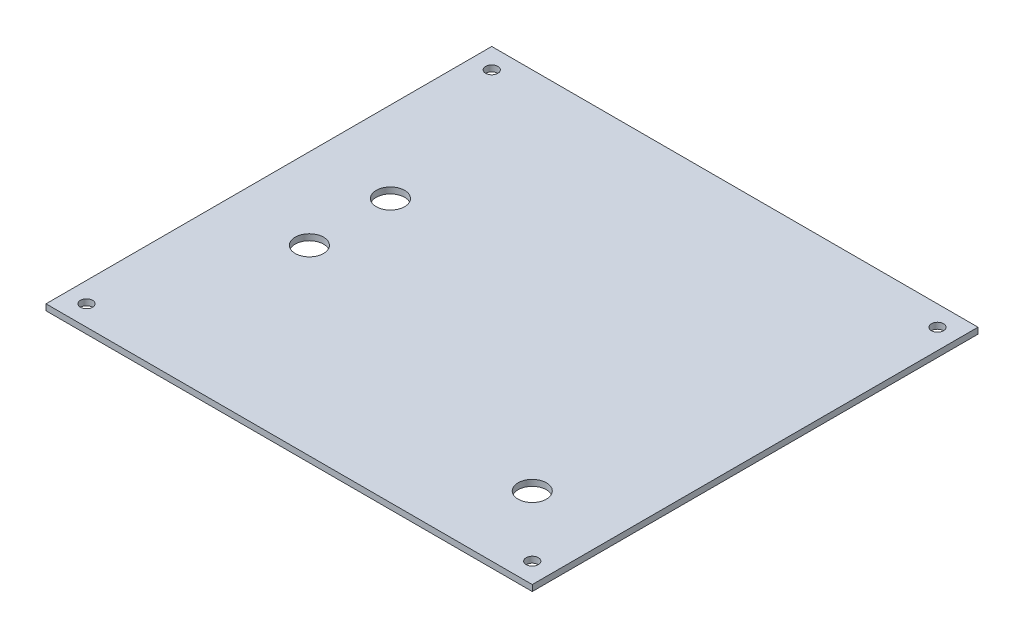
ISO-10303-21;
HEADER;
FILE_DESCRIPTION(('STEP AP214'),'2;1');
FILE_NAME('part.step','',(''),(''),'','','');
FILE_SCHEMA(('AUTOMOTIVE_DESIGN { 1 0 10303 214 1 1 1 1 }'));
ENDSEC;
DATA;
#1=APPLICATION_CONTEXT('core data for automotive mechanical design processes');
#2=APPLICATION_PROTOCOL_DEFINITION('international standard','automotive_design',2000,#1);
#3=PRODUCT_CONTEXT('',#1,'mechanical');
#4=PRODUCT('Part','Part','',(#3));
#5=PRODUCT_RELATED_PRODUCT_CATEGORY('part','',(#4));
#6=PRODUCT_DEFINITION_FORMATION('','',#4);
#7=PRODUCT_DEFINITION_CONTEXT('part definition',#1,'design');
#8=PRODUCT_DEFINITION('design','',#6,#7);
#9=PRODUCT_DEFINITION_SHAPE('','',#8);
#10=(LENGTH_UNIT() NAMED_UNIT(*) SI_UNIT(.MILLI.,.METRE.));
#11=(NAMED_UNIT(*) PLANE_ANGLE_UNIT() SI_UNIT($,.RADIAN.));
#12=(NAMED_UNIT(*) SI_UNIT($,.STERADIAN.) SOLID_ANGLE_UNIT());
#13=UNCERTAINTY_MEASURE_WITH_UNIT(LENGTH_MEASURE(1.E-05),#10,'distance_accuracy_value','');
#14=(GEOMETRIC_REPRESENTATION_CONTEXT(3) GLOBAL_UNCERTAINTY_ASSIGNED_CONTEXT((#13)) GLOBAL_UNIT_ASSIGNED_CONTEXT((#10,
#11,#12)) REPRESENTATION_CONTEXT('',''));
#15=CARTESIAN_POINT('',(0.,0.,0.));
#16=DIRECTION('',(0.,0.,1.));
#17=DIRECTION('',(1.,0.,0.));
#18=AXIS2_PLACEMENT_3D('',#15,#16,#17);
#19=CARTESIAN_POINT('',(0.,1.5,0.));
#20=DIRECTION('',(0.,-1.,0.));
#21=DIRECTION('',(0.,0.,-1.));
#22=AXIS2_PLACEMENT_3D('',#19,#20,#21);
#23=PLANE('',#22);
#24=DIRECTION('',(0.,0.,1.));
#25=VECTOR('',#24,1.);
#26=CARTESIAN_POINT('',(0.,1.5,0.));
#27=LINE('',#26,#25);
#28=CARTESIAN_POINT('',(0.,1.5,-110.));
#29=VERTEX_POINT('',#28);
#30=CARTESIAN_POINT('',(0.,1.5,0.));
#31=VERTEX_POINT('',#30);
#32=EDGE_CURVE('E98',#29,#31,#27,.T.);
#33=ORIENTED_EDGE('',*,*,#32,.T.);
#34=DIRECTION('',(1.,0.,0.));
#35=VECTOR('',#34,1.);
#36=CARTESIAN_POINT('',(0.,1.5,0.));
#37=LINE('',#36,#35);
#38=CARTESIAN_POINT('',(120.,1.5,0.));
#39=VERTEX_POINT('',#38);
#40=EDGE_CURVE('E93',#31,#39,#37,.T.);
#41=ORIENTED_EDGE('',*,*,#40,.T.);
#42=DIRECTION('',(0.,0.,-1.));
#43=VECTOR('',#42,1.);
#44=CARTESIAN_POINT('',(120.,1.5,0.));
#45=LINE('',#44,#43);
#46=CARTESIAN_POINT('',(120.,1.5,-110.));
#47=VERTEX_POINT('',#46);
#48=EDGE_CURVE('E96',#39,#47,#45,.T.);
#49=ORIENTED_EDGE('',*,*,#48,.T.);
#50=DIRECTION('',(-1.,0.,0.));
#51=VECTOR('',#50,1.);
#52=CARTESIAN_POINT('',(0.,1.5,-110.));
#53=LINE('',#52,#51);
#54=EDGE_CURVE('E63',#47,#29,#53,.T.);
#55=ORIENTED_EDGE('',*,*,#54,.T.);
#56=EDGE_LOOP('',(#33,#41,#49,#55));
#57=FACE_BOUND('',#56,.T.);
#58=CARTESIAN_POINT('',(20.,1.5,-65.));
#59=DIRECTION('',(0.,1.,0.));
#60=DIRECTION('',(0.,0.,1.));
#61=AXIS2_PLACEMENT_3D('',#58,#59,#60);
#62=CIRCLE('',#61,3.5);
#63=CARTESIAN_POINT('',(20.,1.5,-61.5));
#64=VERTEX_POINT('',#63);
#65=EDGE_CURVE('E118',#64,#64,#62,.T.);
#66=ORIENTED_EDGE('',*,*,#65,.F.);
#67=EDGE_LOOP('',(#66));
#68=FACE_BOUND('',#67,.T.);
#69=CARTESIAN_POINT('',(5.,1.5,-105.));
#70=DIRECTION('',(0.,1.,0.));
#71=DIRECTION('',(0.,0.,1.));
#72=AXIS2_PLACEMENT_3D('',#69,#70,#71);
#73=CIRCLE('',#72,1.5);
#74=CARTESIAN_POINT('',(5.,1.5,-103.5));
#75=VERTEX_POINT('',#74);
#76=EDGE_CURVE('E140',#75,#75,#73,.T.);
#77=ORIENTED_EDGE('',*,*,#76,.F.);
#78=EDGE_LOOP('',(#77));
#79=FACE_BOUND('',#78,.T.);
#80=CARTESIAN_POINT('',(115.,1.5,-105.));
#81=DIRECTION('',(0.,1.,0.));
#82=DIRECTION('',(0.,0.,1.));
#83=AXIS2_PLACEMENT_3D('',#80,#81,#82);
#84=CIRCLE('',#83,1.5);
#85=CARTESIAN_POINT('',(115.,1.5,-103.5));
#86=VERTEX_POINT('',#85);
#87=EDGE_CURVE('E148',#86,#86,#84,.T.);
#88=ORIENTED_EDGE('',*,*,#87,.F.);
#89=EDGE_LOOP('',(#88));
#90=FACE_BOUND('',#89,.T.);
#91=CARTESIAN_POINT('',(115.,1.5,-5.));
#92=DIRECTION('',(0.,1.,0.));
#93=DIRECTION('',(0.,0.,1.));
#94=AXIS2_PLACEMENT_3D('',#91,#92,#93);
#95=CIRCLE('',#94,1.5);
#96=CARTESIAN_POINT('',(115.,1.5,-3.5));
#97=VERTEX_POINT('',#96);
#98=EDGE_CURVE('E156',#97,#97,#95,.T.);
#99=ORIENTED_EDGE('',*,*,#98,.F.);
#100=EDGE_LOOP('',(#99));
#101=FACE_BOUND('',#100,.T.);
#102=CARTESIAN_POINT('',(5.,1.5,-5.));
#103=DIRECTION('',(0.,1.,0.));
#104=DIRECTION('',(0.,0.,1.));
#105=AXIS2_PLACEMENT_3D('',#102,#103,#104);
#106=CIRCLE('',#105,1.5);
#107=CARTESIAN_POINT('',(5.,1.5,-3.5));
#108=VERTEX_POINT('',#107);
#109=EDGE_CURVE('E164',#108,#108,#106,.T.);
#110=ORIENTED_EDGE('',*,*,#109,.F.);
#111=EDGE_LOOP('',(#110));
#112=FACE_BOUND('',#111,.T.);
#113=CARTESIAN_POINT('',(20.,1.5,-45.));
#114=DIRECTION('',(0.,1.,0.));
#115=DIRECTION('',(0.,0.,1.));
#116=AXIS2_PLACEMENT_3D('',#113,#114,#115);
#117=CIRCLE('',#116,3.5);
#118=CARTESIAN_POINT('',(20.,1.5,-41.5));
#119=VERTEX_POINT('',#118);
#120=EDGE_CURVE('E172',#119,#119,#117,.T.);
#121=ORIENTED_EDGE('',*,*,#120,.F.);
#122=EDGE_LOOP('',(#121));
#123=FACE_BOUND('',#122,.T.);
#124=CARTESIAN_POINT('',(100.,1.5,-20.));
#125=DIRECTION('',(0.,1.,0.));
#126=DIRECTION('',(0.,0.,1.));
#127=AXIS2_PLACEMENT_3D('',#124,#125,#126);
#128=CIRCLE('',#127,3.50000000000001);
#129=CARTESIAN_POINT('',(100.,1.5,-16.5));
#130=VERTEX_POINT('',#129);
#131=EDGE_CURVE('E180',#130,#130,#128,.T.);
#132=ORIENTED_EDGE('',*,*,#131,.F.);
#133=EDGE_LOOP('',(#132));
#134=FACE_BOUND('',#133,.T.);
#135=ADVANCED_FACE('F45',(#57,#68,#79,#90,#101,#112,#123,#134),#23,.F.);
#136=CARTESIAN_POINT('',(0.,0.,0.));
#137=DIRECTION('',(0.,-1.,0.));
#138=DIRECTION('',(0.,0.,-1.));
#139=AXIS2_PLACEMENT_3D('',#136,#137,#138);
#140=PLANE('',#139);
#141=CARTESIAN_POINT('',(20.,0.,-45.));
#142=DIRECTION('',(0.,1.,0.));
#143=DIRECTION('',(0.,0.,1.));
#144=AXIS2_PLACEMENT_3D('',#141,#142,#143);
#145=CIRCLE('',#144,3.5);
#146=CARTESIAN_POINT('',(20.,0.,-41.5));
#147=VERTEX_POINT('',#146);
#148=EDGE_CURVE('E176',#147,#147,#145,.T.);
#149=ORIENTED_EDGE('',*,*,#148,.T.);
#150=EDGE_LOOP('',(#149));
#151=FACE_BOUND('',#150,.T.);
#152=CARTESIAN_POINT('',(115.,0.,-5.));
#153=DIRECTION('',(0.,1.,0.));
#154=DIRECTION('',(0.,0.,1.));
#155=AXIS2_PLACEMENT_3D('',#152,#153,#154);
#156=CIRCLE('',#155,1.5);
#157=CARTESIAN_POINT('',(115.,0.,-3.5));
#158=VERTEX_POINT('',#157);
#159=EDGE_CURVE('E160',#158,#158,#156,.T.);
#160=ORIENTED_EDGE('',*,*,#159,.T.);
#161=EDGE_LOOP('',(#160));
#162=FACE_BOUND('',#161,.T.);
#163=CARTESIAN_POINT('',(5.,0.,-105.));
#164=DIRECTION('',(0.,1.,0.));
#165=DIRECTION('',(0.,0.,1.));
#166=AXIS2_PLACEMENT_3D('',#163,#164,#165);
#167=CIRCLE('',#166,1.5);
#168=CARTESIAN_POINT('',(5.,0.,-103.5));
#169=VERTEX_POINT('',#168);
#170=EDGE_CURVE('E144',#169,#169,#167,.T.);
#171=ORIENTED_EDGE('',*,*,#170,.T.);
#172=EDGE_LOOP('',(#171));
#173=FACE_BOUND('',#172,.T.);
#174=DIRECTION('',(0.,0.,1.));
#175=VECTOR('',#174,1.);
#176=CARTESIAN_POINT('',(0.,0.,0.));
#177=LINE('',#176,#175);
#178=CARTESIAN_POINT('',(0.,0.,-110.));
#179=VERTEX_POINT('',#178);
#180=CARTESIAN_POINT('',(0.,0.,0.));
#181=VERTEX_POINT('',#180);
#182=EDGE_CURVE('E114',#179,#181,#177,.T.);
#183=ORIENTED_EDGE('',*,*,#182,.F.);
#184=DIRECTION('',(-1.,0.,0.));
#185=VECTOR('',#184,1.);
#186=CARTESIAN_POINT('',(0.,0.,-110.));
#187=LINE('',#186,#185);
#188=CARTESIAN_POINT('',(120.,0.,-110.));
#189=VERTEX_POINT('',#188);
#190=EDGE_CURVE('E86',#189,#179,#187,.T.);
#191=ORIENTED_EDGE('',*,*,#190,.F.);
#192=DIRECTION('',(0.,0.,-1.));
#193=VECTOR('',#192,1.);
#194=CARTESIAN_POINT('',(120.,0.,0.));
#195=LINE('',#194,#193);
#196=CARTESIAN_POINT('',(120.,0.,0.));
#197=VERTEX_POINT('',#196);
#198=EDGE_CURVE('E80',#197,#189,#195,.T.);
#199=ORIENTED_EDGE('',*,*,#198,.F.);
#200=DIRECTION('',(1.,0.,0.));
#201=VECTOR('',#200,1.);
#202=CARTESIAN_POINT('',(0.,0.,0.));
#203=LINE('',#202,#201);
#204=EDGE_CURVE('E103',#181,#197,#203,.T.);
#205=ORIENTED_EDGE('',*,*,#204,.F.);
#206=EDGE_LOOP('',(#183,#191,#199,#205));
#207=FACE_BOUND('',#206,.T.);
#208=CARTESIAN_POINT('',(20.,0.,-65.));
#209=DIRECTION('',(0.,1.,0.));
#210=DIRECTION('',(0.,0.,1.));
#211=AXIS2_PLACEMENT_3D('',#208,#209,#210);
#212=CIRCLE('',#211,3.5);
#213=CARTESIAN_POINT('',(20.,0.,-61.5));
#214=VERTEX_POINT('',#213);
#215=EDGE_CURVE('E136',#214,#214,#212,.T.);
#216=ORIENTED_EDGE('',*,*,#215,.T.);
#217=EDGE_LOOP('',(#216));
#218=FACE_BOUND('',#217,.T.);
#219=CARTESIAN_POINT('',(115.,0.,-105.));
#220=DIRECTION('',(0.,1.,0.));
#221=DIRECTION('',(0.,0.,1.));
#222=AXIS2_PLACEMENT_3D('',#219,#220,#221);
#223=CIRCLE('',#222,1.5);
#224=CARTESIAN_POINT('',(115.,0.,-103.5));
#225=VERTEX_POINT('',#224);
#226=EDGE_CURVE('E152',#225,#225,#223,.T.);
#227=ORIENTED_EDGE('',*,*,#226,.T.);
#228=EDGE_LOOP('',(#227));
#229=FACE_BOUND('',#228,.T.);
#230=CARTESIAN_POINT('',(5.,0.,-5.));
#231=DIRECTION('',(0.,1.,0.));
#232=DIRECTION('',(0.,0.,1.));
#233=AXIS2_PLACEMENT_3D('',#230,#231,#232);
#234=CIRCLE('',#233,1.5);
#235=CARTESIAN_POINT('',(5.,0.,-3.5));
#236=VERTEX_POINT('',#235);
#237=EDGE_CURVE('E168',#236,#236,#234,.T.);
#238=ORIENTED_EDGE('',*,*,#237,.T.);
#239=EDGE_LOOP('',(#238));
#240=FACE_BOUND('',#239,.T.);
#241=CARTESIAN_POINT('',(100.,0.,-20.));
#242=DIRECTION('',(0.,1.,0.));
#243=DIRECTION('',(0.,0.,1.));
#244=AXIS2_PLACEMENT_3D('',#241,#242,#243);
#245=CIRCLE('',#244,3.50000000000001);
#246=CARTESIAN_POINT('',(100.,0.,-16.5));
#247=VERTEX_POINT('',#246);
#248=EDGE_CURVE('E184',#247,#247,#245,.T.);
#249=ORIENTED_EDGE('',*,*,#248,.T.);
#250=EDGE_LOOP('',(#249));
#251=FACE_BOUND('',#250,.T.);
#252=ADVANCED_FACE('F131',(#151,#162,#173,#207,#218,#229,#240,#251),#140,.T.);
#253=CARTESIAN_POINT('',(0.,1.5,0.));
#254=DIRECTION('',(1.,0.,0.));
#255=DIRECTION('',(0.,0.,-1.));
#256=AXIS2_PLACEMENT_3D('',#253,#254,#255);
#257=PLANE('',#256);
#258=ORIENTED_EDGE('',*,*,#182,.T.);
#259=DIRECTION('',(0.,-1.,0.));
#260=VECTOR('',#259,1.);
#261=CARTESIAN_POINT('',(0.,1.5,0.));
#262=LINE('',#261,#260);
#263=EDGE_CURVE('E11',#31,#181,#262,.T.);
#264=ORIENTED_EDGE('',*,*,#263,.F.);
#265=ORIENTED_EDGE('',*,*,#32,.F.);
#266=DIRECTION('',(0.,-1.,0.));
#267=VECTOR('',#266,1.);
#268=CARTESIAN_POINT('',(0.,1.5,-110.));
#269=LINE('',#268,#267);
#270=EDGE_CURVE('E110',#29,#179,#269,.T.);
#271=ORIENTED_EDGE('',*,*,#270,.T.);
#272=EDGE_LOOP('',(#258,#264,#265,#271));
#273=FACE_BOUND('',#272,.T.);
#274=ADVANCED_FACE('F47',(#273),#257,.F.);
#275=CARTESIAN_POINT('',(0.,1.5,0.));
#276=DIRECTION('',(0.,0.,-1.));
#277=DIRECTION('',(-1.,0.,0.));
#278=AXIS2_PLACEMENT_3D('',#275,#276,#277);
#279=PLANE('',#278);
#280=ORIENTED_EDGE('',*,*,#204,.T.);
#281=DIRECTION('',(0.,-1.,0.));
#282=VECTOR('',#281,1.);
#283=CARTESIAN_POINT('',(120.,1.5,0.));
#284=LINE('',#283,#282);
#285=EDGE_CURVE('E55',#39,#197,#284,.T.);
#286=ORIENTED_EDGE('',*,*,#285,.F.);
#287=ORIENTED_EDGE('',*,*,#40,.F.);
#288=ORIENTED_EDGE('',*,*,#263,.T.);
#289=EDGE_LOOP('',(#280,#286,#287,#288));
#290=FACE_BOUND('',#289,.T.);
#291=ADVANCED_FACE('F102',(#290),#279,.F.);
#292=CARTESIAN_POINT('',(120.,1.5,0.));
#293=DIRECTION('',(-1.,0.,0.));
#294=DIRECTION('',(0.,0.,1.));
#295=AXIS2_PLACEMENT_3D('',#292,#293,#294);
#296=PLANE('',#295);
#297=ORIENTED_EDGE('',*,*,#198,.T.);
#298=DIRECTION('',(0.,-1.,0.));
#299=VECTOR('',#298,1.);
#300=CARTESIAN_POINT('',(120.,1.5,-110.));
#301=LINE('',#300,#299);
#302=EDGE_CURVE('E105',#47,#189,#301,.T.);
#303=ORIENTED_EDGE('',*,*,#302,.F.);
#304=ORIENTED_EDGE('',*,*,#48,.F.);
#305=ORIENTED_EDGE('',*,*,#285,.T.);
#306=EDGE_LOOP('',(#297,#303,#304,#305));
#307=FACE_BOUND('',#306,.T.);
#308=ADVANCED_FACE('F106',(#307),#296,.F.);
#309=CARTESIAN_POINT('',(0.,1.5,-110.));
#310=DIRECTION('',(0.,0.,1.));
#311=DIRECTION('',(1.,0.,0.));
#312=AXIS2_PLACEMENT_3D('',#309,#310,#311);
#313=PLANE('',#312);
#314=ORIENTED_EDGE('',*,*,#190,.T.);
#315=ORIENTED_EDGE('',*,*,#270,.F.);
#316=ORIENTED_EDGE('',*,*,#54,.F.);
#317=ORIENTED_EDGE('',*,*,#302,.T.);
#318=EDGE_LOOP('',(#314,#315,#316,#317));
#319=FACE_BOUND('',#318,.T.);
#320=ADVANCED_FACE('F128',(#319),#313,.F.);
#321=CARTESIAN_POINT('',(20.,1.5,-65.));
#322=DIRECTION('',(0.,-1.,0.));
#323=DIRECTION('',(0.,0.,-1.));
#324=AXIS2_PLACEMENT_3D('',#321,#322,#323);
#325=CYLINDRICAL_SURFACE('',#324,3.5);
#326=ORIENTED_EDGE('',*,*,#65,.T.);
#327=EDGE_LOOP('',(#326));
#328=FACE_BOUND('',#327,.T.);
#329=ORIENTED_EDGE('',*,*,#215,.F.);
#330=EDGE_LOOP('',(#329));
#331=FACE_BOUND('',#330,.T.);
#332=ADVANCED_FACE('F203',(#328,#331),#325,.F.);
#333=CARTESIAN_POINT('',(5.,1.5,-105.));
#334=DIRECTION('',(0.,-1.,0.));
#335=DIRECTION('',(0.,0.,-1.));
#336=AXIS2_PLACEMENT_3D('',#333,#334,#335);
#337=CYLINDRICAL_SURFACE('',#336,1.5);
#338=ORIENTED_EDGE('',*,*,#76,.T.);
#339=EDGE_LOOP('',(#338));
#340=FACE_BOUND('',#339,.T.);
#341=ORIENTED_EDGE('',*,*,#170,.F.);
#342=EDGE_LOOP('',(#341));
#343=FACE_BOUND('',#342,.T.);
#344=ADVANCED_FACE('F248',(#340,#343),#337,.F.);
#345=CARTESIAN_POINT('',(115.,1.5,-105.));
#346=DIRECTION('',(0.,-1.,0.));
#347=DIRECTION('',(0.,0.,-1.));
#348=AXIS2_PLACEMENT_3D('',#345,#346,#347);
#349=CYLINDRICAL_SURFACE('',#348,1.5);
#350=ORIENTED_EDGE('',*,*,#87,.T.);
#351=EDGE_LOOP('',(#350));
#352=FACE_BOUND('',#351,.T.);
#353=ORIENTED_EDGE('',*,*,#226,.F.);
#354=EDGE_LOOP('',(#353));
#355=FACE_BOUND('',#354,.T.);
#356=ADVANCED_FACE('F256',(#352,#355),#349,.F.);
#357=CARTESIAN_POINT('',(115.,1.5,-5.));
#358=DIRECTION('',(0.,-1.,0.));
#359=DIRECTION('',(0.,0.,-1.));
#360=AXIS2_PLACEMENT_3D('',#357,#358,#359);
#361=CYLINDRICAL_SURFACE('',#360,1.5);
#362=ORIENTED_EDGE('',*,*,#98,.T.);
#363=EDGE_LOOP('',(#362));
#364=FACE_BOUND('',#363,.T.);
#365=ORIENTED_EDGE('',*,*,#159,.F.);
#366=EDGE_LOOP('',(#365));
#367=FACE_BOUND('',#366,.T.);
#368=ADVANCED_FACE('F264',(#364,#367),#361,.F.);
#369=CARTESIAN_POINT('',(5.,1.5,-5.));
#370=DIRECTION('',(0.,-1.,0.));
#371=DIRECTION('',(0.,0.,-1.));
#372=AXIS2_PLACEMENT_3D('',#369,#370,#371);
#373=CYLINDRICAL_SURFACE('',#372,1.5);
#374=ORIENTED_EDGE('',*,*,#109,.T.);
#375=EDGE_LOOP('',(#374));
#376=FACE_BOUND('',#375,.T.);
#377=ORIENTED_EDGE('',*,*,#237,.F.);
#378=EDGE_LOOP('',(#377));
#379=FACE_BOUND('',#378,.T.);
#380=ADVANCED_FACE('F273',(#376,#379),#373,.F.);
#381=CARTESIAN_POINT('',(20.,1.5,-45.));
#382=DIRECTION('',(0.,-1.,0.));
#383=DIRECTION('',(0.,0.,-1.));
#384=AXIS2_PLACEMENT_3D('',#381,#382,#383);
#385=CYLINDRICAL_SURFACE('',#384,3.5);
#386=ORIENTED_EDGE('',*,*,#120,.T.);
#387=EDGE_LOOP('',(#386));
#388=FACE_BOUND('',#387,.T.);
#389=ORIENTED_EDGE('',*,*,#148,.F.);
#390=EDGE_LOOP('',(#389));
#391=FACE_BOUND('',#390,.T.);
#392=ADVANCED_FACE('F282',(#388,#391),#385,.F.);
#393=CARTESIAN_POINT('',(100.,1.5,-20.));
#394=DIRECTION('',(0.,-1.,0.));
#395=DIRECTION('',(0.,0.,-1.));
#396=AXIS2_PLACEMENT_3D('',#393,#394,#395);
#397=CYLINDRICAL_SURFACE('',#396,3.50000000000001);
#398=ORIENTED_EDGE('',*,*,#131,.T.);
#399=EDGE_LOOP('',(#398));
#400=FACE_BOUND('',#399,.T.);
#401=ORIENTED_EDGE('',*,*,#248,.F.);
#402=EDGE_LOOP('',(#401));
#403=FACE_BOUND('',#402,.T.);
#404=ADVANCED_FACE('F192',(#400,#403),#397,.F.);
#405=CLOSED_SHELL('',(#135,#252,#274,#291,#308,#320,#332,#344,#356,#368,#380,#392,#404));
#406=MANIFOLD_SOLID_BREP('B2',#405);
#407=ADVANCED_BREP_SHAPE_REPRESENTATION('',(#18,#406),#14);
#408=SHAPE_DEFINITION_REPRESENTATION(#9,#407);
ENDSEC;
END-ISO-10303-21;
